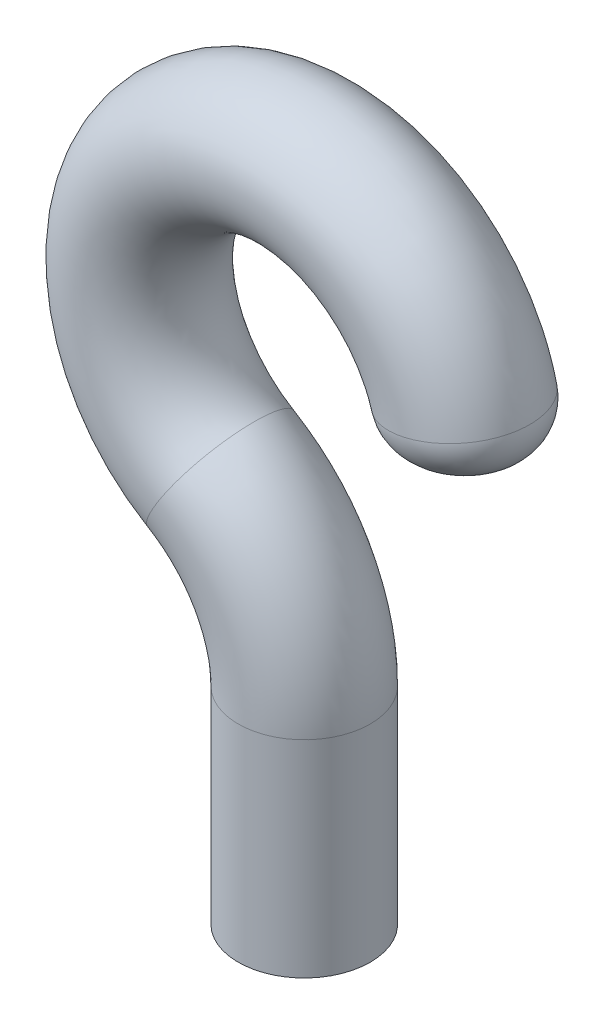
ISO-10303-21;
HEADER;
FILE_DESCRIPTION(('STEP AP214'),'2;1');
FILE_NAME('part.step','',(''),(''),'','','');
FILE_SCHEMA(('AUTOMOTIVE_DESIGN { 1 0 10303 214 1 1 1 1 }'));
ENDSEC;
DATA;
#1=APPLICATION_CONTEXT('core data for automotive mechanical design processes');
#2=APPLICATION_PROTOCOL_DEFINITION('international standard','automotive_design',2000,#1);
#3=PRODUCT_CONTEXT('',#1,'mechanical');
#4=PRODUCT('Part','Part','',(#3));
#5=PRODUCT_RELATED_PRODUCT_CATEGORY('part','',(#4));
#6=PRODUCT_DEFINITION_FORMATION('','',#4);
#7=PRODUCT_DEFINITION_CONTEXT('part definition',#1,'design');
#8=PRODUCT_DEFINITION('design','',#6,#7);
#9=PRODUCT_DEFINITION_SHAPE('','',#8);
#10=(LENGTH_UNIT() NAMED_UNIT(*) SI_UNIT(.MILLI.,.METRE.));
#11=(NAMED_UNIT(*) PLANE_ANGLE_UNIT() SI_UNIT($,.RADIAN.));
#12=(NAMED_UNIT(*) SI_UNIT($,.STERADIAN.) SOLID_ANGLE_UNIT());
#13=UNCERTAINTY_MEASURE_WITH_UNIT(LENGTH_MEASURE(1.E-05),#10,'distance_accuracy_value','');
#14=(GEOMETRIC_REPRESENTATION_CONTEXT(3) GLOBAL_UNCERTAINTY_ASSIGNED_CONTEXT((#13)) GLOBAL_UNIT_ASSIGNED_CONTEXT((#10,
#11,#12)) REPRESENTATION_CONTEXT('',''));
#15=CARTESIAN_POINT('',(0.,0.,0.));
#16=DIRECTION('',(0.,0.,1.));
#17=DIRECTION('',(1.,0.,0.));
#18=AXIS2_PLACEMENT_3D('',#15,#16,#17);
#19=CARTESIAN_POINT('',(0.,0.,0.));
#20=DIRECTION('',(0.,-1.,0.));
#21=DIRECTION('',(1.,0.,0.));
#22=AXIS2_PLACEMENT_3D('',#19,#20,#21);
#23=PLANE('',#22);
#24=CARTESIAN_POINT('',(0.,0.,0.));
#25=DIRECTION('',(0.,-1.,0.));
#26=DIRECTION('',(1.,0.,0.));
#27=AXIS2_PLACEMENT_3D('',#24,#25,#26);
#28=CIRCLE('',#27,8.);
#29=CARTESIAN_POINT('',(8.,0.,0.));
#30=VERTEX_POINT('',#29);
#31=EDGE_CURVE('E124',#30,#30,#28,.T.);
#32=ORIENTED_EDGE('',*,*,#31,.T.);
#33=EDGE_LOOP('',(#32));
#34=FACE_BOUND('',#33,.T.);
#35=ADVANCED_FACE('F59',(#34),#23,.T.);
#36=CARTESIAN_POINT('',(20.,60.,0.));
#37=DIRECTION('',(0.,1.,0.));
#38=DIRECTION('',(-1.,0.,0.));
#39=AXIS2_PLACEMENT_3D('',#36,#37,#38);
#40=PLANE('',#39);
#41=CARTESIAN_POINT('',(16.2618908759128,60.,-0.281152869066457));
#42=CARTESIAN_POINT('',(12.5808000122126,60.,-0.64366995944001));
#43=CARTESIAN_POINT('',(11.5037278122202,63.5370203563657,-0.749740984177219));
#44=CARTESIAN_POINT('',(16.2458822694731,60.,-0.118615996266872));
#45=CARTESIAN_POINT('',(12.5512844146098,60.,-0.27131834357954));
#46=CARTESIAN_POINT('',(11.463747210949,63.5282095474617,-0.316309323364496));
#47=CARTESIAN_POINT('',(16.2437879383055,60.,0.0452813253369241));
#48=CARTESIAN_POINT('',(12.5474297867421,60.,0.10355309511955));
#49=CARTESIAN_POINT('',(11.4585193383136,63.5270515150473,0.120750200913203));
#50=CARTESIAN_POINT('',(16.267495149422,60.,0.371033167207862));
#51=CARTESIAN_POINT('',(12.5911400482759,60.,0.849646199939272));
#52=CARTESIAN_POINT('',(11.5177226959657,63.540107899219,0.989421779226957));
#53=CARTESIAN_POINT('',(16.2932941115352,60.,0.532887875018828));
#54=CARTESIAN_POINT('',(12.6388041875576,60.,1.2217525056459));
#55=CARTESIAN_POINT('',(11.5821474832792,63.5543208939624,1.42103433337988));
#56=CARTESIAN_POINT('',(16.3713729663751,60.,0.848127126232877));
#57=CARTESIAN_POINT('',(12.7839625379838,60.,1.95185373712059));
#58=CARTESIAN_POINT('',(11.7773020467233,63.5969687614819,2.26167233662462));
#59=CARTESIAN_POINT('',(16.4233531783033,60.,1.00158620702204));
#60=CARTESIAN_POINT('',(12.8812217703401,60.,2.31075302678102));
#61=CARTESIAN_POINT('',(11.9072814806789,63.625242642568,2.67089655207903));
#62=CARTESIAN_POINT('',(16.5518121936954,60.,1.2978670387577));
#63=CARTESIAN_POINT('',(13.1240755538737,60.,3.01290813260286));
#64=CARTESIAN_POINT('',(12.2289083151599,63.694262664922,3.46097877004093));
#65=CARTESIAN_POINT('',(16.6282930017694,60.,1.44068791812007));
#66=CARTESIAN_POINT('',(13.2701842730918,60.,3.35678680470936));
#67=CARTESIAN_POINT('',(12.4205607617049,63.7350098267271,3.8418344483241));
#68=CARTESIAN_POINT('',(16.8051390678291,60.,1.71501988386927));
#69=CARTESIAN_POINT('',(13.612847679346,60.,4.03028141885387));
#70=CARTESIAN_POINT('',(12.8644046606862,63.8277690920251,4.57338635698074));
#71=CARTESIAN_POINT('',(16.9059798488634,60.,1.84622402372532));
#72=CARTESIAN_POINT('',(13.8110662802493,60.,4.35982742678917));
#73=CARTESIAN_POINT('',(13.1178024084085,63.8800033372224,4.9232640632727));
#74=CARTESIAN_POINT('',(17.1274863268592,60.,2.09065388234775));
#75=CARTESIAN_POINT('',(14.254286620086,60.,4.99042533740005));
#76=CARTESIAN_POINT('',(13.6754018690417,63.9926018622284,5.57507701960225));
#77=CARTESIAN_POINT('',(17.2481556397653,60.,2.20387631453805));
#78=CARTESIAN_POINT('',(14.5000637949476,60.,5.29167165371732));
#79=CARTESIAN_POINT('',(13.9796128484557,64.0529676245436,5.87700350543691));
#80=CARTESIAN_POINT('',(17.5109688949754,60.,2.41386095333499));
#81=CARTESIAN_POINT('',(15.0466330799358,60.,5.87068463045248));
#82=CARTESIAN_POINT('',(14.6434045856121,64.1817100164551,6.43696254222446));
#83=CARTESIAN_POINT('',(17.6537718234099,60.,2.50979842386869));
#84=CARTESIAN_POINT('',(15.3499547710288,60.,6.1468661545977));
#85=CARTESIAN_POINT('',(15.0046952133111,64.2503086213688,6.69279579698317));
#86=CARTESIAN_POINT('',(17.953020207868,60.,2.6772987303337));
#87=CARTESIAN_POINT('',(16.0009294844488,60.,6.65423758814892));
#88=CARTESIAN_POINT('',(15.7632553143582,64.3907255107411,7.13946328089115));
#89=CARTESIAN_POINT('',(18.1094682202902,60.,2.74885698645976));
#90=CARTESIAN_POINT('',(16.3494069882561,60.,6.8850589808609));
#91=CARTESIAN_POINT('',(16.160531530125,64.4625443972876,7.33028529722645));
#92=CARTESIAN_POINT('',(18.4374955030945,60.,2.86803878034177));
#93=CARTESIAN_POINT('',(17.0991988131757,60.,7.3011929009417));
#94=CARTESIAN_POINT('',(16.9950532738844,64.6095050424572,7.64810341424428));
#95=CARTESIAN_POINT('',(18.6094134918577,60.,2.91473155020154));
#96=CARTESIAN_POINT('',(17.5025065923706,60.,7.48383881210342));
#97=CARTESIAN_POINT('',(17.4332133157145,64.6846748034845,7.7726174672037));
#98=CARTESIAN_POINT('',(18.9586094286399,60.,2.97907867508696));
#99=CARTESIAN_POINT('',(18.3446658404575,60.,7.78359770443968));
#100=CARTESIAN_POINT('',(18.3247807212504,64.8335247868576,7.94420980023185));
#101=CARTESIAN_POINT('',(19.1358879734987,60.,2.99672978442457));
#102=CARTESIAN_POINT('',(18.7840404127311,60.,7.89976161266582));
#103=CARTESIAN_POINT('',(18.7781897834051,64.9072048418055,7.99127942513247));
#104=CARTESIAN_POINT('',(19.493612040792,60.,3.00248436416937));
#105=CARTESIAN_POINT('',(19.695945049024,60.,8.05888775457199));
#106=CARTESIAN_POINT('',(19.6945773861898,65.0522218795414,8.00662497111801));
#107=CARTESIAN_POINT('',(19.674065081985,60.,2.99013928025242));
#108=CARTESIAN_POINT('',(20.1689938769738,60.,8.09955076996975));
#109=CARTESIAN_POINT('',(20.1575972675688,65.1235069309457,7.97370474733855));
#110=CARTESIAN_POINT('',(20.0302916881253,60.,2.93508576879008));
#111=CARTESIAN_POINT('',(21.1294089154471,60.,8.09579162468792));
#112=CARTESIAN_POINT('',(21.0729361088531,65.2608782424795,7.82689538344063));
#113=CARTESIAN_POINT('',(20.2060653142237,60.,2.89237773823265));
#114=CARTESIAN_POINT('',(21.6166062799968,60.,8.05013915915731));
#115=CARTESIAN_POINT('',(21.5252552085886,65.3269645705686,7.71300730195676));
#116=CARTESIAN_POINT('',(20.5463635185295,60.,2.77797041571153));
#117=CARTESIAN_POINT('',(22.5854712587725,60.,7.86801037184488));
#118=CARTESIAN_POINT('',(22.4020139154227,65.4520909190075,7.40792110856108));
#119=CARTESIAN_POINT('',(20.7109667396955,60.,2.70650543581994));
#120=CARTESIAN_POINT('',(23.0666322574753,60.,7.73111671693399));
#121=CARTESIAN_POINT('',(22.8266473655763,65.5111830093778,7.21734782884168));
#122=CARTESIAN_POINT('',(21.0254260949413,60.,2.53631782558011));
#123=CARTESIAN_POINT('',(24.008862091394,60.,7.36403104945795));
#124=CARTESIAN_POINT('',(23.6386858426653,65.6218666032233,6.76351420153673));
#125=CARTESIAN_POINT('',(21.1752845252772,60.,2.43759944863775));
#126=CARTESIAN_POINT('',(24.4689884139016,60.,7.13294458923444));
#127=CARTESIAN_POINT('',(24.0260966661844,65.6734592752075,6.50026519636687));
#128=CARTESIAN_POINT('',(21.4522043063191,60.,2.21812995591815));
#129=CARTESIAN_POINT('',(25.3380739904197,60.,6.58537817285635));
#130=CARTESIAN_POINT('',(24.7425603422513,65.7671999443096,5.91501321578217));
#131=CARTESIAN_POINT('',(21.5797172909112,60.,2.09794886362765));
#132=CARTESIAN_POINT('',(25.7469201274732,60.,6.27044870637211));
#133=CARTESIAN_POINT('',(25.0727672490233,65.8095408030597,5.59453030299909));
#134=CARTESIAN_POINT('',(21.8120981869005,60.,1.83732083217697));
#135=CARTESIAN_POINT('',(26.5057459022602,60.,5.55915763921726));
#136=CARTESIAN_POINT('',(25.6749034768655,65.8856764095204,4.89952221914158));
#137=CARTESIAN_POINT('',(21.9169637173621,60.,1.69687176482349));
#138=CARTESIAN_POINT('',(26.8544339318242,60.,5.16272875139727));
#139=CARTESIAN_POINT('',(25.9468266705238,65.9194702587445,4.52499137288506));
#140=CARTESIAN_POINT('',(22.0980873325046,60.,1.40377142167034));
#141=CARTESIAN_POINT('',(27.4653900520082,60.,4.31223193231362));
#142=CARTESIAN_POINT('',(26.416694046721,65.97726043339,3.74339045776573));
#143=CARTESIAN_POINT('',(22.1750311770022,60.,1.25154324721084));
#144=CARTESIAN_POINT('',(27.7286054854783,60.,3.86029509292721));
#145=CARTESIAN_POINT('',(26.6164110857531,66.0014931145366,3.33744865914555));
#146=CARTESIAN_POINT('',(22.3015459223703,60.,0.936262120927675));
#147=CARTESIAN_POINT('',(28.165723360356,60.,2.90745909341295));
#148=CARTESIAN_POINT('',(26.9448805918248,66.041090907743,2.49669898906042));
#149=CARTESIAN_POINT('',(22.3511551274053,60.,0.77322467720349));
#150=CARTESIAN_POINT('',(28.3388300034919,60.,2.40742209109318));
#151=CARTESIAN_POINT('',(27.0737323622401,66.0564684299515,2.06193247252724));
#152=CARTESIAN_POINT('',(22.4074495932239,60.,0.507497356796045));
#153=CARTESIAN_POINT('',(28.5362534954651,60.,1.58477018414842));
#154=CARTESIAN_POINT('',(27.2199643586837,66.0738704961903,1.35332628479872));
#155=CARTESIAN_POINT('',(22.4233631128775,60.,0.406672851627802));
#156=CARTESIAN_POINT('',(28.5922745289463,60.,1.27097627402974));
#157=CARTESIAN_POINT('',(27.2613069488785,66.07877458008,1.08446093767487));
#158=CARTESIAN_POINT('',(22.4446128654959,60.,0.203914524118326));
#159=CARTESIAN_POINT('',(28.6672083745801,60.,0.638042154107024));
#160=CARTESIAN_POINT('',(27.3165145757888,66.0853180348787,0.543772064308329));
#161=CARTESIAN_POINT('',(22.4499492178503,60.,0.101980714311415));
#162=CARTESIAN_POINT('',(28.6860593959014,60.,0.319161097768362));
#163=CARTESIAN_POINT('',(27.3303799226533,66.0869574426378,0.271948571490494));
#164=CARTESIAN_POINT('',(22.4499363773823,60.,-0.165412554932186));
#165=CARTESIAN_POINT('',(28.6860084488215,60.,-0.517678580456176));
#166=CARTESIAN_POINT('',(27.3303460369717,66.0869550280431,-0.441100146475106));
#167=CARTESIAN_POINT('',(22.435876253921,60.,-0.33094850993058));
#168=CARTESIAN_POINT('',(28.636348128529,60.,-1.03517066519513));
#169=CARTESIAN_POINT('',(27.2938130274226,66.0826380284676,-0.882529359777605));
#170=CARTESIAN_POINT('',(22.3800354721447,60.,-0.65741434919152));
#171=CARTESIAN_POINT('',(28.4399723543357,60.,-2.04999054132469));
#172=CARTESIAN_POINT('',(27.1487496254772,66.0654050557791,-1.75310493114086));
#173=CARTESIAN_POINT('',(22.3382208170638,60.,-0.81833833171031));
#174=CARTESIAN_POINT('',(28.2935645594843,60.,-2.54623283356249));
#175=CARTESIAN_POINT('',(27.0401309347295,66.0524785367244,-2.18223555121834));
#176=CARTESIAN_POINT('',(22.2282340205207,60.,-1.13074819505411));
#177=CARTESIAN_POINT('',(27.9117666079277,60.,-3.49757888854556));
#178=CARTESIAN_POINT('',(26.7545282052502,66.0181829813969,-3.01532852015343));
#179=CARTESIAN_POINT('',(22.1600865750479,60.,-1.28224276506862));
#180=CARTESIAN_POINT('',(27.6772431101659,60.,-3.95189813539925));
#181=CARTESIAN_POINT('',(26.5776082224608,65.9968218550415,-3.41931404018308));
#182=CARTESIAN_POINT('',(21.9995759558585,60.,-1.57174057619382));
#183=CARTESIAN_POINT('',(27.1317437362654,60.,-4.80293728283055));
#184=CARTESIAN_POINT('',(26.1611081947024,65.9459135271802,-4.19130820318027));
#185=CARTESIAN_POINT('',(21.907218074434,60.,-1.70974675676549));
#186=CARTESIAN_POINT('',(26.8217995495376,60.,-5.19919573323958));
#187=CARTESIAN_POINT('',(25.9215418439749,65.9163681146423,-4.55932468471043));
#188=CARTESIAN_POINT('',(21.7000757940008,60.,-1.96992432264224));
#189=CARTESIAN_POINT('',(26.1377593161479,60.,-5.92517492626771));
#190=CARTESIAN_POINT('',(25.3845826558708,65.8491233810558,-5.2531315270435));
#191=CARTESIAN_POINT('',(21.5850843976591,60.,-2.09193078329331));
#192=CARTESIAN_POINT('',(25.7641747943228,60.,-6.25416438257834));
#193=CARTESIAN_POINT('',(25.086656209942,65.8113484266095,-5.5784820887689));
#194=CARTESIAN_POINT('',(21.3366549387635,60.,-2.31543409150232));
#195=CARTESIAN_POINT('',(24.9725248242933,60.,-6.832752903826));
#196=CARTESIAN_POINT('',(24.4435262802132,65.7283010041212,-6.17449091065932));
#197=CARTESIAN_POINT('',(21.2032144431434,60.,-2.41692822954291));
#198=CARTESIAN_POINT('',(24.5555223174544,60.,-7.08264792206502));
#199=CARTESIAN_POINT('',(24.0983165607537,65.6830275470208,-6.44514194544471));
#200=CARTESIAN_POINT('',(20.9184453429093,60.,-2.59904020915024));
#201=CARTESIAN_POINT('',(23.6849807023025,60.,-7.50432961191674));
#202=CARTESIAN_POINT('',(23.3623248651603,65.5844870698225,-6.93077389107044));
#203=CARTESIAN_POINT('',(20.7667770461126,60.,-2.67912668958915));
#204=CARTESIAN_POINT('',(23.2316475357232,60.,-7.6749161435223));
#205=CARTESIAN_POINT('',(22.9706802348639,65.5310607228904,-7.14433783890288));
#206=CARTESIAN_POINT('',(20.4524026779396,60.,-2.81345255863912));
#207=CARTESIAN_POINT('',(22.3146410797723,60.,-7.93009260758032));
#208=CARTESIAN_POINT('',(22.1598151858932,65.4178460051715,-7.50254015636741));
#209=CARTESIAN_POINT('',(20.2896951275405,60.,-2.86768847598729));
#210=CARTESIAN_POINT('',(21.8516216678248,60.,-8.01558656974777));
#211=CARTESIAN_POINT('',(21.74059107239,65.3580567812834,-7.64716926929848));
#212=CARTESIAN_POINT('',(19.9532341394844,60.,-2.95026589587319));
#213=CARTESIAN_POINT('',(20.9186837978348,60.,-8.1058147124774));
#214=CARTESIAN_POINT('',(20.8748113785212,65.2314812783383,-7.86737572232949));
#215=CARTESIAN_POINT('',(19.7793019295373,60.,-2.97787930191185));
#216=CARTESIAN_POINT('',(20.449088744982,60.,-8.10945941037655));
#217=CARTESIAN_POINT('',(20.4278252453151,65.1645510588401,-7.94101147176513));
#218=CARTESIAN_POINT('',(19.4292617739274,60.,-3.00417529126038));
#219=CARTESIAN_POINT('',(19.5294008000888,60.,-8.0373270833533));
#220=CARTESIAN_POINT('',(19.5296082892687,65.026445437917,-8.01113411002733));
#221=CARTESIAN_POINT('',(19.2531535473669,60.,-3.0028540996279));
#222=CARTESIAN_POINT('',(19.0792938249742,60.,-7.96266245605767));
#223=CARTESIAN_POINT('',(19.0783769202513,64.9552694837818,-8.00761093234097));
#224=CARTESIAN_POINT('',(18.8998128042928,60.,-2.97111693970031));
#225=CARTESIAN_POINT('',(18.2006300942117,60.,-7.74004504218216));
#226=CARTESIAN_POINT('',(18.1745165882562,64.8088190224771,-7.92297850586761));
#227=CARTESIAN_POINT('',(18.7226352167455,60.,-2.94008652693151));
#228=CARTESIAN_POINT('',(17.7722349924699,60.,-7.59160923836679));
#229=CARTESIAN_POINT('',(17.722059717808,64.7334896814772,-7.84023073848408));
#230=CARTESIAN_POINT('',(18.3759319633241,60.,-2.84887857690609));
#231=CARTESIAN_POINT('',(16.956404411207,60.,-7.23033546309801));
#232=CARTESIAN_POINT('',(16.838265540232,64.5823216516915,-7.59700953841562));
#233=CARTESIAN_POINT('',(18.2064068886374,60.,-2.78869879194186));
#234=CARTESIAN_POINT('',(16.5683155515061,60.,-7.01835357560607));
#235=CARTESIAN_POINT('',(16.4069298645838,64.5064829240718,-7.43653011184373));
#236=CARTESIAN_POINT('',(17.8791001768255,60.,-2.64033591261805));
#237=CARTESIAN_POINT('',(15.8380728790147,60.,-6.53853604050121));
#238=CARTESIAN_POINT('',(15.5756686550271,64.3565208545671,-7.0408957669827));
#239=CARTESIAN_POINT('',(17.7213775763794,60.,-2.55202233107516));
#240=CARTESIAN_POINT('',(15.4952472926514,60.,-6.27100705006541));
#241=CARTESIAN_POINT('',(15.175900536822,64.2824072680658,-6.80539288287143));
#242=CARTESIAN_POINT('',(17.423368637526,60.,-2.34967700055829));
#243=CARTESIAN_POINT('',(14.8626274686951,60.,-5.69015004513524));
#244=CARTESIAN_POINT('',(14.4219328995805,64.1392877574522,-6.26580533482255));
#245=CARTESIAN_POINT('',(17.2830811332312,60.,-2.23564697268359));
#246=CARTESIAN_POINT('',(14.5718347088359,60.,-5.37706544446777));
#247=CARTESIAN_POINT('',(14.0677303335133,64.0702814919376,-5.96172526048305));
#248=CARTESIAN_POINT('',(17.0270562442486,60.,-1.98727710491859));
#249=CARTESIAN_POINT('',(14.0519384274455,60.,-4.72053642082235));
#250=CARTESIAN_POINT('',(13.4223985907265,63.9419654002523,-5.29940561312265));
#251=CARTESIAN_POINT('',(16.9108946471072,60.,-1.85337514846967));
#252=CARTESIAN_POINT('',(13.8208297955443,60.,-4.3777475523734));
#253=CARTESIAN_POINT('',(13.1301771906462,63.882493163005,-4.94233372927825));
#254=CARTESIAN_POINT('',(16.7037901476338,60.,-1.56730060435088));
#255=CARTESIAN_POINT('',(13.4156067395888,60.,-3.66509584612646));
#256=CARTESIAN_POINT('',(12.6099060777422,63.7748992606814,-4.17946827828902));
#257=CARTESIAN_POINT('',(16.6128410818767,60.,-1.41513249506018));
#258=CARTESIAN_POINT('',(13.2405946967469,60.,-3.29478574771486));
#259=CARTESIAN_POINT('',(12.3818406812179,63.7267748219664,-3.77368665348865));
#260=CARTESIAN_POINT('',(16.4625867509667,60.,-1.10318432855496));
#261=CARTESIAN_POINT('',(12.9550082443007,60.,-2.5499454371383));
#262=CARTESIAN_POINT('',(12.0054466181636,63.6464593854808,-2.94182487615153));
#263=CARTESIAN_POINT('',(16.4021869785558,60.,-0.943931579848307));
#264=CARTESIAN_POINT('',(12.8415736375529,60.,-2.17554470171662));
#265=CARTESIAN_POINT('',(11.8543583048125,63.6137208095986,-2.51715087963347));
#266=CARTESIAN_POINT('',(16.3101564871029,60.,-0.61732465181917));
#267=CARTESIAN_POINT('',(12.6700370225344,60.,-1.41648254569901));
#268=CARTESIAN_POINT('',(11.6242712905327,63.5635789821164,-1.64619907156046));
#269=CARTESIAN_POINT('',(16.278518293515,60.,-0.449972589256767));
#270=CARTESIAN_POINT('',(12.6114991636253,60.,-1.03095260192435));
#271=CARTESIAN_POINT('',(11.5452538598388,63.5461717462516,-1.19992690469908));
#272=CARTESIAN_POINT('',(16.2618908759128,60.,-0.281152869066457));
#273=CARTESIAN_POINT('',(12.5808000122126,60.,-0.64366995944001));
#274=CARTESIAN_POINT('',(11.5037278122202,63.5370203563657,-0.749740984177219));
#275=(BOUNDED_SURFACE() B_SPLINE_SURFACE(3,2,((#41,#42,#43),(#44,#45,#46),(#47,#48,#49),(#50,
#51,#52),(#53,#54,#55),(#56,#57,#58),(#59,#60,#61),(#62,#63,#64),(#65,#66,#67),(#68,#69,#70),
(#71,#72,#73),(#74,#75,#76),(#77,#78,#79),(#80,#81,#82),(#83,#84,#85),(#86,#87,#88),(#89,#90,
#91),(#92,#93,#94),(#95,#96,#97),(#98,#99,#100),(#101,#102,#103),(#104,#105,#106),(#107,#108,
#109),(#110,#111,#112),(#113,#114,#115),(#116,#117,#118),(#119,#120,#121),(#122,#123,#124),
(#125,#126,#127),(#128,#129,#130),(#131,#132,#133),(#134,#135,#136),(#137,#138,#139),(#140,#141,
#142),(#143,#144,#145),(#146,#147,#148),(#149,#150,#151),(#152,#153,#154),(#155,#156,#157),
(#158,#159,#160),(#161,#162,#163),(#164,#165,#166),(#167,#168,#169),(#170,#171,#172),(#173,#174,
#175),(#176,#177,#178),(#179,#180,#181),(#182,#183,#184),(#185,#186,#187),(#188,#189,#190),
(#191,#192,#193),(#194,#195,#196),(#197,#198,#199),(#200,#201,#202),(#203,#204,#205),(#206,#207,
#208),(#209,#210,#211),(#212,#213,#214),(#215,#216,#217),(#218,#219,#220),(#221,#222,#223),
(#224,#225,#226),(#227,#228,#229),(#230,#231,#232),(#233,#234,#235),(#236,#237,#238),(#239,#240,
#241),(#242,#243,#244),(#245,#246,#247),(#248,#249,#250),(#251,#252,#253),(#254,#255,#256),
(#257,#258,#259),(#260,#261,#262),(#263,#264,#265),(#266,#267,#268),(#269,#270,#271),(#272,#273,
#274)),.UNSPECIFIED.,.T.,.F.,.F.) B_SPLINE_SURFACE_WITH_KNOTS((4,2,2,2,2,2,2,2,2,2,2,2,2,2,2,2,
2,2,2,2,2,2,2,2,2,2,2,2,2,2,2,2,2,2,2,2,2,2,4),(3,3),(0.,0.489357546293465,0.978669830163277,
1.46250438150951,1.94637852974884,2.44059399265948,2.93489968126528,3.4486896056986,
3.96257599599576,4.49454413238206,5.02657171734458,5.56660391790132,6.10662905780129,
6.64234039033284,7.17796816224075,7.70105414255483,8.22419508835905,8.73344318813132,
9.24197584930734,9.54768911197319,9.85339892388468,10.3492597481352,10.8457290802567,
11.3417339283888,11.8376304423813,12.3382927126135,12.8390210732533,13.3512174747374,
13.8634826355671,14.3893906004034,14.9153671780504,15.452462381346,15.9895990066386,
16.5292641090514,17.0688931045417,17.5980324277579,18.1270422839163,18.6354480617742,
19.1437216775718),(0.,1.),
.UNSPECIFIED.) GEOMETRIC_REPRESENTATION_ITEM() RATIONAL_B_SPLINE_SURFACE(((1.,0.80392659140212,
1.),(1.,0.804474577642972,1.),(1.,0.804546468400725,1.),(1.,0.803734637980058,1.),(1.,
0.802851005188978,1.),(1.,0.800190500808279,1.),(1.,0.798423739549861,1.),(1.,0.794089663374567,
1.),(1.,0.791522282952423,1.),(1.,0.785641062529042,1.),(1.,0.782312441933888,1.),(1.,
0.775082485533414,1.),(1.,0.771181045282151,1.),(1.,0.762789128922667,1.),(1.,0.758281496348021,
1.),(1.,0.748965389062627,1.),(1.,0.744156858026612,1.),(1.,0.734217296369055,1.),(1.,
0.729080871505359,1.),(1.,0.718800367387103,1.),(1.,0.713656287341294,1.),(1.,0.703423337032511,
1.),(1.,0.698336461876507,1.),(1.,0.688430629351976,1.),(1.,0.683611668481423,1.),(1.,
0.674397500502129,1.),(1.,0.66999921588171,1.),(1.,0.661687713344857,1.),(1.,0.657774419874394,
1.),(1.,0.650609377836596,1.),(1.,0.647344284646232,1.),(1.,0.641436750863029,1.),(1.,
0.638794375734119,1.),(1.,0.634254666799047,1.),(1.,0.632339410770113,1.),(1.,0.629200598691686,
1.),(1.,0.627976074658587,1.),(1.,0.626588538277182,1.),(1.,0.626196942371141,1.),(1.,
0.625674247890554,1.),(1.,0.625543146375681,1.),(1.,0.625543397551441,1.),(1.,0.625888717153372,
1.),(1.,0.627263860589099,1.),(1.,0.628294523909151,1.),(1.,0.631017866401391,1.),(1.,
0.632709925306367,1.),(1.,0.636720231717513,1.),(1.,0.639038342374939,1.),(1.,0.644278337633737,
1.),(1.,0.647205810635419,1.),(1.,0.653590143328748,1.),(1.,0.657047072851585,1.),(1.,
0.664503941196758,1.),(1.,0.668514503129493,1.),(1.,0.676929161385726,1.),(1.,0.681333310466618,
1.),(1.,0.690560417646742,1.),(1.,0.695391405822803,1.),(1.,0.70525155390898,1.),(1.,
0.710280739591429,1.),(1.,0.720517048032249,1.),(1.,0.725725684873582,1.),(1.,0.736066958891511,
1.),(1.,0.741199590175862,1.),(1.,0.751247810844973,1.),(1.,0.756162264809241,1.),(1.,
0.765567341557824,1.),(1.,0.770057992677059,1.),(1.,0.778344612090777,1.),(1.,0.782152387251744,
1.),(1.,0.789000538225469,1.),(1.,0.792041101573553,1.),(1.,0.79709487891797,1.),(1.,
0.799143494046786,1.),(1.,0.802274640490967,1.),(1.,0.803357422805141,1.),(1.,0.80392659140212,1.))) REPRESENTATION_ITEM('') SURFACE());
#276=CARTESIAN_POINT('',(16.2618908759128,60.,-0.281152869066457));
#277=CARTESIAN_POINT('',(16.278518293515,60.,-0.449972589256767));
#278=CARTESIAN_POINT('',(16.3101564871029,60.,-0.61732465181917));
#279=CARTESIAN_POINT('',(16.4021869785558,60.,-0.943931579848307));
#280=CARTESIAN_POINT('',(16.4625867509667,60.,-1.10318432855496));
#281=CARTESIAN_POINT('',(16.6128410818767,60.,-1.41513249506018));
#282=CARTESIAN_POINT('',(16.7037901476338,60.,-1.56730060435088));
#283=CARTESIAN_POINT('',(16.9108946471072,60.,-1.85337514846967));
#284=CARTESIAN_POINT('',(17.0270562442486,60.,-1.98727710491859));
#285=CARTESIAN_POINT('',(17.2830811332312,60.,-2.23564697268359));
#286=CARTESIAN_POINT('',(17.423368637526,60.,-2.34967700055829));
#287=CARTESIAN_POINT('',(17.7213775763794,60.,-2.55202233107516));
#288=CARTESIAN_POINT('',(17.8791001768255,60.,-2.64033591261805));
#289=CARTESIAN_POINT('',(18.2064068886374,60.,-2.78869879194186));
#290=CARTESIAN_POINT('',(18.3759319633241,60.,-2.84887857690609));
#291=CARTESIAN_POINT('',(18.7226352167455,60.,-2.94008652693151));
#292=CARTESIAN_POINT('',(18.8998128042928,60.,-2.97111693970031));
#293=CARTESIAN_POINT('',(19.2531535473669,60.,-3.0028540996279));
#294=CARTESIAN_POINT('',(19.4292617739274,60.,-3.00417529126038));
#295=CARTESIAN_POINT('',(19.7793019295373,60.,-2.97787930191185));
#296=CARTESIAN_POINT('',(19.9532341394844,60.,-2.95026589587319));
#297=CARTESIAN_POINT('',(20.2896951275405,60.,-2.86768847598729));
#298=CARTESIAN_POINT('',(20.4524026779396,60.,-2.81345255863912));
#299=CARTESIAN_POINT('',(20.7667770461126,60.,-2.67912668958915));
#300=CARTESIAN_POINT('',(20.9184453429093,60.,-2.59904020915024));
#301=CARTESIAN_POINT('',(21.2032144431434,60.,-2.41692822954291));
#302=CARTESIAN_POINT('',(21.3366549387635,60.,-2.31543409150232));
#303=CARTESIAN_POINT('',(21.5850843976591,60.,-2.09193078329331));
#304=CARTESIAN_POINT('',(21.7000757940008,60.,-1.96992432264224));
#305=CARTESIAN_POINT('',(21.907218074434,60.,-1.70974675676549));
#306=CARTESIAN_POINT('',(21.9995759558585,60.,-1.57174057619382));
#307=CARTESIAN_POINT('',(22.1600865750479,60.,-1.28224276506862));
#308=CARTESIAN_POINT('',(22.2282340205207,60.,-1.13074819505411));
#309=CARTESIAN_POINT('',(22.3382208170638,60.,-0.81833833171031));
#310=CARTESIAN_POINT('',(22.3800354721447,60.,-0.65741434919152));
#311=CARTESIAN_POINT('',(22.435876253921,60.,-0.33094850993058));
#312=CARTESIAN_POINT('',(22.4499363773823,60.,-0.165412554932185));
#313=CARTESIAN_POINT('',(22.4499492178503,60.,0.101980714311415));
#314=CARTESIAN_POINT('',(22.4446128654959,60.,0.203914524118326));
#315=CARTESIAN_POINT('',(22.4233631128775,60.,0.406672851627802));
#316=CARTESIAN_POINT('',(22.4074495932239,60.,0.507497356796045));
#317=CARTESIAN_POINT('',(22.3511551274053,60.,0.773224677203491));
#318=CARTESIAN_POINT('',(22.3015459223703,60.,0.936262120927675));
#319=CARTESIAN_POINT('',(22.1750311770022,60.,1.25154324721084));
#320=CARTESIAN_POINT('',(22.0980873325046,60.,1.40377142167034));
#321=CARTESIAN_POINT('',(21.9169637173621,60.,1.69687176482349));
#322=CARTESIAN_POINT('',(21.8120981869005,60.,1.83732083217697));
#323=CARTESIAN_POINT('',(21.5797172909112,60.,2.09794886362765));
#324=CARTESIAN_POINT('',(21.4522043063191,60.,2.21812995591815));
#325=CARTESIAN_POINT('',(21.1752845252772,60.,2.43759944863775));
#326=CARTESIAN_POINT('',(21.0254260949413,60.,2.53631782558011));
#327=CARTESIAN_POINT('',(20.7109667396955,60.,2.70650543581994));
#328=CARTESIAN_POINT('',(20.5463635185295,60.,2.77797041571153));
#329=CARTESIAN_POINT('',(20.2060653142237,60.,2.89237773823265));
#330=CARTESIAN_POINT('',(20.0302916881253,60.,2.93508576879008));
#331=CARTESIAN_POINT('',(19.674065081985,60.,2.99013928025242));
#332=CARTESIAN_POINT('',(19.493612040792,60.,3.00248436416937));
#333=CARTESIAN_POINT('',(19.1358879734987,60.,2.99672978442457));
#334=CARTESIAN_POINT('',(18.9586094286399,60.,2.97907867508696));
#335=CARTESIAN_POINT('',(18.6094134918577,60.,2.91473155020154));
#336=CARTESIAN_POINT('',(18.4374955030945,60.,2.86803878034177));
#337=CARTESIAN_POINT('',(18.1094682202902,60.,2.74885698645976));
#338=CARTESIAN_POINT('',(17.953020207868,60.,2.6772987303337));
#339=CARTESIAN_POINT('',(17.6537718234099,60.,2.50979842386869));
#340=CARTESIAN_POINT('',(17.5109688949754,60.,2.41386095333499));
#341=CARTESIAN_POINT('',(17.2481556397653,60.,2.20387631453805));
#342=CARTESIAN_POINT('',(17.1274863268592,60.,2.09065388234775));
#343=CARTESIAN_POINT('',(16.9059798488634,60.,1.84622402372532));
#344=CARTESIAN_POINT('',(16.8051390678291,60.,1.71501988386927));
#345=CARTESIAN_POINT('',(16.6282930017694,60.,1.44068791812008));
#346=CARTESIAN_POINT('',(16.5518121936954,60.,1.2978670387577));
#347=CARTESIAN_POINT('',(16.4233531783033,60.,1.00158620702204));
#348=CARTESIAN_POINT('',(16.3713729663751,60.,0.848127126232877));
#349=CARTESIAN_POINT('',(16.2932941115352,60.,0.532887875018828));
#350=CARTESIAN_POINT('',(16.267495149422,60.,0.371033167207862));
#351=CARTESIAN_POINT('',(16.2437879383055,60.,0.0452813253369242));
#352=CARTESIAN_POINT('',(16.2458822694731,60.,-0.118615996266873));
#353=CARTESIAN_POINT('',(16.2618908759128,60.,-0.281152869066457));
#354=B_SPLINE_CURVE_WITH_KNOTS('',3,(#276,#277,#278,#279,#280,#281,#282,#283,#284,#285,#286,
#287,#288,#289,#290,#291,#292,#293,#294,#295,#296,#297,#298,#299,#300,#301,#302,#303,#304,#305,
#306,#307,#308,#309,#310,#311,#312,#313,#314,#315,#316,#317,#318,#319,#320,#321,#322,#323,#324,
#325,#326,#327,#328,#329,#330,#331,#332,#333,#334,#335,#336,#337,#338,#339,#340,#341,#342,#343,
#344,#345,#346,#347,#348,#349,#350,#351,#352,#353),.UNSPECIFIED.,.T.,.F.,(4,2,2,2,2,2,2,2,2,2,2,
2,2,2,2,2,2,2,2,2,2,2,2,2,2,2,2,2,2,2,2,2,2,2,2,2,2,2,4),(0.,0.5082736157976,1.01667939365551,
1.545689249814,2.07482857303016,2.61445756852045,3.15412267093325,3.69125929622587,
4.22835449952148,4.75433107716848,5.28023904200474,5.79250420283447,6.30470060431859,
6.80542896495839,7.30609123519053,7.80198774918307,8.29799259731517,8.79446192943661,
9.29032275368717,9.59603256559866,9.90174582826451,10.4102784894405,10.9195265892128,
11.442667535017,11.9657535153311,12.501381287239,13.0370926197706,13.5771177596705,
14.1171499602273,14.6491775451898,15.1811456815761,15.6950320718732,16.2088219963066,
16.7031276849124,17.197343147823,17.6812172960623,18.1650518474086,18.6543641312784,
19.1437216775718),.UNSPECIFIED.);
#355=CARTESIAN_POINT('',(16.2618908759128,60.,-0.281152869066457));
#356=VERTEX_POINT('',#355);
#357=EDGE_CURVE('E11',#356,#356,#354,.T.);
#358=ORIENTED_EDGE('',*,*,#357,.T.);
#359=EDGE_LOOP('',(#358));
#360=FACE_BOUND('',#359,.T.);
#361=ADVANCED_FACE('F90',(#360),#40,.F.);
#362=CARTESIAN_POINT('',(0.,0.,0.));
#363=DIRECTION('',(0.,1.,0.));
#364=DIRECTION('',(0.,0.,1.));
#365=AXIS2_PLACEMENT_3D('',#362,#363,#364);
#366=CYLINDRICAL_SURFACE('',#365,8.);
#367=CARTESIAN_POINT('',(0.,25.,0.));
#368=DIRECTION('',(0.,-1.,0.));
#369=DIRECTION('',(1.,0.,0.));
#370=AXIS2_PLACEMENT_3D('',#367,#368,#369);
#371=CIRCLE('',#370,8.);
#372=CARTESIAN_POINT('',(8.,25.,0.));
#373=VERTEX_POINT('',#372);
#374=EDGE_CURVE('E121',#373,#373,#371,.T.);
#375=ORIENTED_EDGE('',*,*,#374,.T.);
#376=EDGE_LOOP('',(#375));
#377=FACE_BOUND('',#376,.T.);
#378=ORIENTED_EDGE('',*,*,#31,.F.);
#379=EDGE_LOOP('',(#378));
#380=FACE_BOUND('',#379,.T.);
#381=ADVANCED_FACE('F111',(#377,#380),#366,.T.);
#382=CARTESIAN_POINT('',(-20.625,25.,0.));
#383=DIRECTION('',(0.,0.,1.));
#384=DIRECTION('',(1.,0.,0.));
#385=AXIS2_PLACEMENT_3D('',#382,#383,#384);
#386=TOROIDAL_SURFACE('',#385,20.625,8.);
#387=CARTESIAN_POINT('',(-10.1538461538462,42.7692307692308,0.));
#388=DIRECTION('',(0.861538461538461,-0.507692307692308,0.));
#389=DIRECTION('',(0.507692307692308,0.861538461538462,0.));
#390=AXIS2_PLACEMENT_3D('',#387,#388,#389);
#391=CIRCLE('',#390,8.);
#392=CARTESIAN_POINT('',(-6.09230769230769,49.6615384615384,0.));
#393=VERTEX_POINT('',#392);
#394=EDGE_CURVE('E77',#393,#393,#391,.T.);
#395=CARTESIAN_POINT('',(-20.625,25.,0.));
#396=DIRECTION('',(0.,0.,1.));
#397=DIRECTION('',(1.,0.,0.));
#398=AXIS2_PLACEMENT_3D('',#395,#396,#397);
#399=CIRCLE('',#398,28.625);
#400=EDGE_CURVE('',#373,#393,#399,.T.);
#401=ORIENTED_EDGE('',*,*,#374,.F.);
#402=ORIENTED_EDGE('',*,*,#394,.T.);
#403=ORIENTED_EDGE('',*,*,#400,.T.);
#404=ORIENTED_EDGE('',*,*,#400,.F.);
#405=EDGE_LOOP('',(#401,#403,#402,#404));
#406=FACE_BOUND('',#405,.T.);
#407=ADVANCED_FACE('F106',(#406),#386,.T.);
#408=CARTESIAN_POINT('',(0.,60.,0.));
#409=DIRECTION('',(0.,0.,-1.));
#410=DIRECTION('',(-1.,0.,0.));
#411=AXIS2_PLACEMENT_3D('',#408,#409,#410);
#412=TOROIDAL_SURFACE('',#411,20.,8.);
#413=CARTESIAN_POINT('',(11.5037278122202,63.5370203563657,-0.749740984177219));
#414=CARTESIAN_POINT('',(11.463747210949,63.5282095474617,-0.316309323364497));
#415=CARTESIAN_POINT('',(11.4585193383136,63.5270515150473,0.120750200913203));
#416=CARTESIAN_POINT('',(11.5177226959657,63.540107899219,0.989421779226957));
#417=CARTESIAN_POINT('',(11.5821474832792,63.5543208939624,1.42103433337988));
#418=CARTESIAN_POINT('',(11.7773020467233,63.5969687614819,2.26167233662462));
#419=CARTESIAN_POINT('',(11.9072814806789,63.625242642568,2.67089655207903));
#420=CARTESIAN_POINT('',(12.2289083151599,63.694262664922,3.46097877004093));
#421=CARTESIAN_POINT('',(12.4205607617049,63.7350098267271,3.8418344483241));
#422=CARTESIAN_POINT('',(12.8644046606862,63.8277690920251,4.57338635698074));
#423=CARTESIAN_POINT('',(13.1178024084085,63.8800033372224,4.9232640632727));
#424=CARTESIAN_POINT('',(13.6754018690417,63.9926018622284,5.57507701960225));
#425=CARTESIAN_POINT('',(13.9796128484557,64.0529676245436,5.87700350543691));
#426=CARTESIAN_POINT('',(14.6434045856121,64.1817100164551,6.43696254222446));
#427=CARTESIAN_POINT('',(15.0046952133111,64.2503086213688,6.69279579698317));
#428=CARTESIAN_POINT('',(15.7632553143582,64.3907255107411,7.13946328089115));
#429=CARTESIAN_POINT('',(16.160531530125,64.4625443972876,7.33028529722645));
#430=CARTESIAN_POINT('',(16.9950532738844,64.6095050424572,7.64810341424429));
#431=CARTESIAN_POINT('',(17.4332133157145,64.6846748034845,7.7726174672037));
#432=CARTESIAN_POINT('',(18.3247807212504,64.8335247868576,7.94420980023185));
#433=CARTESIAN_POINT('',(18.7781897834051,64.9072048418055,7.99127942513247));
#434=CARTESIAN_POINT('',(19.6945773861898,65.0522218795415,8.00662497111801));
#435=CARTESIAN_POINT('',(20.1575972675688,65.1235069309457,7.97370474733855));
#436=CARTESIAN_POINT('',(21.0729361088531,65.2608782424795,7.82689538344063));
#437=CARTESIAN_POINT('',(21.5252552085886,65.3269645705686,7.71300730195676));
#438=CARTESIAN_POINT('',(22.4020139154227,65.4520909190075,7.40792110856108));
#439=CARTESIAN_POINT('',(22.8266473655763,65.5111830093779,7.21734782884168));
#440=CARTESIAN_POINT('',(23.6386858426653,65.6218666032233,6.76351420153673));
#441=CARTESIAN_POINT('',(24.0260966661844,65.6734592752075,6.50026519636687));
#442=CARTESIAN_POINT('',(24.7425603422513,65.7671999443096,5.91501321578217));
#443=CARTESIAN_POINT('',(25.0727672490233,65.8095408030597,5.59453030299909));
#444=CARTESIAN_POINT('',(25.6749034768655,65.8856764095204,4.89952221914158));
#445=CARTESIAN_POINT('',(25.9468266705238,65.9194702587445,4.52499137288506));
#446=CARTESIAN_POINT('',(26.416694046721,65.97726043339,3.74339045776573));
#447=CARTESIAN_POINT('',(26.6164110857531,66.0014931145366,3.33744865914555));
#448=CARTESIAN_POINT('',(26.9448805918248,66.041090907743,2.49669898906043));
#449=CARTESIAN_POINT('',(27.0737323622401,66.0564684299515,2.06193247252724));
#450=CARTESIAN_POINT('',(27.2199643586837,66.0738704961903,1.35332628479872));
#451=CARTESIAN_POINT('',(27.2613069488785,66.07877458008,1.08446093767487));
#452=CARTESIAN_POINT('',(27.3165145757888,66.0853180348787,0.543772064308328));
#453=CARTESIAN_POINT('',(27.3303799226533,66.0869574426378,0.271948571490494));
#454=CARTESIAN_POINT('',(27.3303460369717,66.0869550280431,-0.441100146475104));
#455=CARTESIAN_POINT('',(27.2938130274226,66.0826380284676,-0.882529359777605));
#456=CARTESIAN_POINT('',(27.1487496254772,66.0654050557791,-1.75310493114086));
#457=CARTESIAN_POINT('',(27.0401309347295,66.0524785367244,-2.18223555121834));
#458=CARTESIAN_POINT('',(26.7545282052502,66.0181829813969,-3.01532852015343));
#459=CARTESIAN_POINT('',(26.5776082224608,65.9968218550415,-3.41931404018308));
#460=CARTESIAN_POINT('',(26.1611081947024,65.9459135271802,-4.19130820318027));
#461=CARTESIAN_POINT('',(25.9215418439749,65.9163681146423,-4.55932468471043));
#462=CARTESIAN_POINT('',(25.3845826558708,65.8491233810558,-5.2531315270435));
#463=CARTESIAN_POINT('',(25.086656209942,65.8113484266095,-5.5784820887689));
#464=CARTESIAN_POINT('',(24.4435262802132,65.7283010041212,-6.17449091065932));
#465=CARTESIAN_POINT('',(24.0983165607537,65.6830275470208,-6.44514194544471));
#466=CARTESIAN_POINT('',(23.3623248651603,65.5844870698225,-6.93077389107044));
#467=CARTESIAN_POINT('',(22.9706802348639,65.5310607228904,-7.14433783890287));
#468=CARTESIAN_POINT('',(22.1598151858932,65.4178460051715,-7.50254015636741));
#469=CARTESIAN_POINT('',(21.74059107239,65.3580567812834,-7.64716926929848));
#470=CARTESIAN_POINT('',(20.8748113785212,65.2314812783383,-7.86737572232949));
#471=CARTESIAN_POINT('',(20.4278252453151,65.1645510588401,-7.94101147176513));
#472=CARTESIAN_POINT('',(19.5296082892687,65.0264454379169,-8.01113411002733));
#473=CARTESIAN_POINT('',(19.0783769202513,64.9552694837818,-8.00761093234097));
#474=CARTESIAN_POINT('',(18.1745165882562,64.8088190224771,-7.92297850586761));
#475=CARTESIAN_POINT('',(17.722059717808,64.7334896814772,-7.84023073848408));
#476=CARTESIAN_POINT('',(16.838265540232,64.5823216516915,-7.59700953841562));
#477=CARTESIAN_POINT('',(16.4069298645838,64.5064829240718,-7.43653011184373));
#478=CARTESIAN_POINT('',(15.5756686550271,64.3565208545671,-7.0408957669827));
#479=CARTESIAN_POINT('',(15.175900536822,64.2824072680658,-6.80539288287143));
#480=CARTESIAN_POINT('',(14.4219328995805,64.1392877574522,-6.26580533482255));
#481=CARTESIAN_POINT('',(14.0677303335133,64.0702814919376,-5.96172526048305));
#482=CARTESIAN_POINT('',(13.4223985907265,63.9419654002523,-5.29940561312265));
#483=CARTESIAN_POINT('',(13.1301771906462,63.882493163005,-4.94233372927825));
#484=CARTESIAN_POINT('',(12.6099060777422,63.7748992606814,-4.17946827828902));
#485=CARTESIAN_POINT('',(12.3818406812179,63.7267748219664,-3.77368665348865));
#486=CARTESIAN_POINT('',(12.0054466181636,63.6464593854808,-2.94182487615153));
#487=CARTESIAN_POINT('',(11.8543583048125,63.6137208095986,-2.51715087963347));
#488=CARTESIAN_POINT('',(11.6242712905327,63.5635789821164,-1.64619907156046));
#489=CARTESIAN_POINT('',(11.5452538598388,63.5461717462516,-1.19992690469908));
#490=CARTESIAN_POINT('',(11.5037278122202,63.5370203563657,-0.749740984177219));
#491=B_SPLINE_CURVE_WITH_KNOTS('',3,(#413,#414,#415,#416,#417,#418,#419,#420,#421,#422,#423,
#424,#425,#426,#427,#428,#429,#430,#431,#432,#433,#434,#435,#436,#437,#438,#439,#440,#441,#442,
#443,#444,#445,#446,#447,#448,#449,#450,#451,#452,#453,#454,#455,#456,#457,#458,#459,#460,#461,
#462,#463,#464,#465,#466,#467,#468,#469,#470,#471,#472,#473,#474,#475,#476,#477,#478,#479,#480,
#481,#482,#483,#484,#485,#486,#487,#488,#489,#490),.UNSPECIFIED.,.T.,.F.,(4,2,2,2,2,2,2,2,2,2,2,
2,2,2,2,2,2,2,2,2,2,2,2,2,2,2,2,2,2,2,2,2,2,2,2,2,2,2,4),(0.,0.489357546293465,
0.978669830163277,1.46250438150951,1.94637852974884,2.44059399265948,2.93489968126528,
3.4486896056986,3.96257599599576,4.49454413238206,5.02657171734458,5.56660391790132,
6.10662905780129,6.64234039033284,7.17796816224075,7.70105414255483,8.22419508835905,
8.73344318813132,9.24197584930734,9.54768911197319,9.85339892388468,10.3492597481352,
10.8457290802567,11.3417339283888,11.8376304423813,12.3382927126135,12.8390210732533,
13.3512174747374,13.8634826355671,14.3893906004034,14.9153671780504,15.452462381346,
15.9895990066386,16.5292641090514,17.0688931045417,17.5980324277579,18.1270422839163,
18.6354480617742,19.1437216775718),.UNSPECIFIED.);
#492=CARTESIAN_POINT('',(11.5037278122202,63.5370203563657,-0.749740984177219));
#493=VERTEX_POINT('',#492);
#494=EDGE_CURVE('E71',#493,#493,#491,.T.);
#495=ORIENTED_EDGE('',*,*,#494,.T.);
#496=EDGE_LOOP('',(#495));
#497=FACE_BOUND('',#496,.T.);
#498=ORIENTED_EDGE('',*,*,#394,.F.);
#499=EDGE_LOOP('',(#498));
#500=FACE_BOUND('',#499,.T.);
#501=ADVANCED_FACE('F99',(#497,#500),#412,.T.);
#502=CARTESIAN_POINT('',(16.2618908759128,65.,-0.281152869066457));
#503=DIRECTION('',(0.0980067743372278,0.,-0.995185747578818));
#504=DIRECTION('',(0.,-1.,0.));
#505=AXIS2_PLACEMENT_3D('',#502,#503,#504);
#506=CIRCLE('',#505,5.);
#507=EDGE_CURVE('',#356,#493,#506,.T.);
#508=ORIENTED_EDGE('',*,*,#357,.F.);
#509=ORIENTED_EDGE('',*,*,#494,.F.);
#510=ORIENTED_EDGE('',*,*,#507,.T.);
#511=ORIENTED_EDGE('',*,*,#507,.F.);
#512=EDGE_LOOP('',(#508,#510,#509,#511));
#513=FACE_BOUND('',#512,.T.);
#514=ADVANCED_FACE('F96',(#513),#275,.T.);
#515=CLOSED_SHELL('',(#35,#361,#381,#407,#501,#514));
#516=MANIFOLD_SOLID_BREP('B2',#515);
#517=ADVANCED_BREP_SHAPE_REPRESENTATION('',(#18,#516),#14);
#518=SHAPE_DEFINITION_REPRESENTATION(#9,#517);
ENDSEC;
END-ISO-10303-21;
